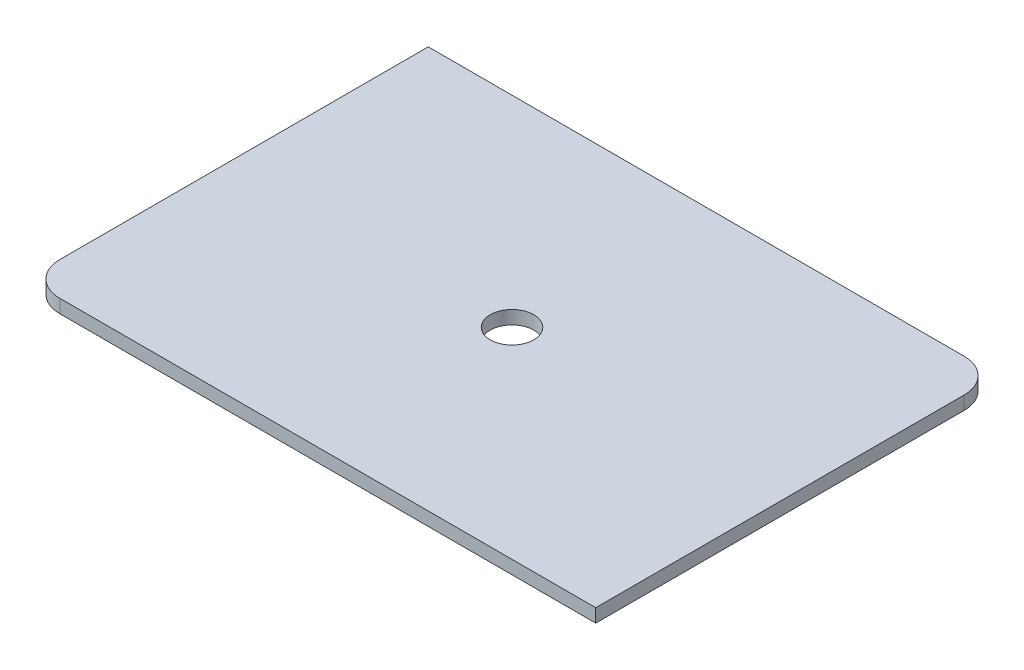
ISO-10303-21;
HEADER;
FILE_DESCRIPTION(('STEP AP214'),'2;1');
FILE_NAME('part.step','',(''),(''),'','','');
FILE_SCHEMA(('AUTOMOTIVE_DESIGN { 1 0 10303 214 1 1 1 1 }'));
ENDSEC;
DATA;
#1=APPLICATION_CONTEXT('core data for automotive mechanical design processes');
#2=APPLICATION_PROTOCOL_DEFINITION('international standard','automotive_design',2000,#1);
#3=PRODUCT_CONTEXT('',#1,'mechanical');
#4=PRODUCT('Part','Part','',(#3));
#5=PRODUCT_RELATED_PRODUCT_CATEGORY('part','',(#4));
#6=PRODUCT_DEFINITION_FORMATION('','',#4);
#7=PRODUCT_DEFINITION_CONTEXT('part definition',#1,'design');
#8=PRODUCT_DEFINITION('design','',#6,#7);
#9=PRODUCT_DEFINITION_SHAPE('','',#8);
#10=(LENGTH_UNIT() NAMED_UNIT(*) SI_UNIT(.MILLI.,.METRE.));
#11=(NAMED_UNIT(*) PLANE_ANGLE_UNIT() SI_UNIT($,.RADIAN.));
#12=(NAMED_UNIT(*) SI_UNIT($,.STERADIAN.) SOLID_ANGLE_UNIT());
#13=UNCERTAINTY_MEASURE_WITH_UNIT(LENGTH_MEASURE(1.E-05),#10,'distance_accuracy_value','');
#14=(GEOMETRIC_REPRESENTATION_CONTEXT(3) GLOBAL_UNCERTAINTY_ASSIGNED_CONTEXT((#13)) GLOBAL_UNIT_ASSIGNED_CONTEXT((#10,
#11,#12)) REPRESENTATION_CONTEXT('',''));
#15=CARTESIAN_POINT('',(0.,0.,0.));
#16=DIRECTION('',(0.,0.,1.));
#17=DIRECTION('',(1.,0.,0.));
#18=AXIS2_PLACEMENT_3D('',#15,#16,#17);
#19=CARTESIAN_POINT('',(85.,-4.,60.));
#20=DIRECTION('',(0.,0.,1.));
#21=DIRECTION('',(1.,0.,0.));
#22=AXIS2_PLACEMENT_3D('',#19,#20,#21);
#23=PLANE('',#22);
#24=DIRECTION('',(1.,0.,0.));
#25=VECTOR('',#24,1.);
#26=CARTESIAN_POINT('',(85.,0.,60.));
#27=LINE('',#26,#25);
#28=CARTESIAN_POINT('',(-74.9999999999999,0.,60.));
#29=VERTEX_POINT('',#28);
#30=CARTESIAN_POINT('',(85.,0.,60.));
#31=VERTEX_POINT('',#30);
#32=EDGE_CURVE('E124',#29,#31,#27,.T.);
#33=ORIENTED_EDGE('',*,*,#32,.F.);
#34=DIRECTION('',(0.,1.,0.));
#35=VECTOR('',#34,1.);
#36=CARTESIAN_POINT('',(-74.9999999999999,-4.,60.));
#37=LINE('',#36,#35);
#38=CARTESIAN_POINT('',(-74.9999999999999,-4.,60.));
#39=VERTEX_POINT('',#38);
#40=EDGE_CURVE('E11',#39,#29,#37,.T.);
#41=ORIENTED_EDGE('',*,*,#40,.F.);
#42=DIRECTION('',(1.,0.,0.));
#43=VECTOR('',#42,1.);
#44=CARTESIAN_POINT('',(85.,-4.,60.));
#45=LINE('',#44,#43);
#46=CARTESIAN_POINT('',(85.,-4.,60.));
#47=VERTEX_POINT('',#46);
#48=EDGE_CURVE('E139',#39,#47,#45,.T.);
#49=ORIENTED_EDGE('',*,*,#48,.T.);
#50=DIRECTION('',(0.,1.,0.));
#51=VECTOR('',#50,1.);
#52=CARTESIAN_POINT('',(85.,-4.,60.));
#53=LINE('',#52,#51);
#54=EDGE_CURVE('E42',#47,#31,#53,.T.);
#55=ORIENTED_EDGE('',*,*,#54,.T.);
#56=EDGE_LOOP('',(#33,#41,#49,#55));
#57=FACE_BOUND('',#56,.T.);
#58=ADVANCED_FACE('F39',(#57),#23,.T.);
#59=CARTESIAN_POINT('',(-75.,-4.,50.));
#60=DIRECTION('',(0.,1.,0.));
#61=DIRECTION('',(0.,0.,1.));
#62=AXIS2_PLACEMENT_3D('',#59,#60,#61);
#63=CYLINDRICAL_SURFACE('',#62,10.);
#64=CARTESIAN_POINT('',(-75.,0.,50.));
#65=DIRECTION('',(0.,1.,0.));
#66=DIRECTION('',(0.,0.,-1.));
#67=AXIS2_PLACEMENT_3D('',#64,#65,#66);
#68=CIRCLE('',#67,10.);
#69=CARTESIAN_POINT('',(-85.,0.,49.9999999999999));
#70=VERTEX_POINT('',#69);
#71=EDGE_CURVE('E137',#70,#29,#68,.T.);
#72=ORIENTED_EDGE('',*,*,#71,.F.);
#73=DIRECTION('',(0.,1.,0.));
#74=VECTOR('',#73,1.);
#75=CARTESIAN_POINT('',(-85.,-4.,49.9999999999999));
#76=LINE('',#75,#74);
#77=CARTESIAN_POINT('',(-85.,-4.,49.9999999999999));
#78=VERTEX_POINT('',#77);
#79=EDGE_CURVE('E48',#78,#70,#76,.T.);
#80=ORIENTED_EDGE('',*,*,#79,.F.);
#81=CARTESIAN_POINT('',(-75.,-4.,50.));
#82=DIRECTION('',(0.,1.,0.));
#83=DIRECTION('',(0.,0.,-1.));
#84=AXIS2_PLACEMENT_3D('',#81,#82,#83);
#85=CIRCLE('',#84,10.);
#86=EDGE_CURVE('E114',#78,#39,#85,.T.);
#87=ORIENTED_EDGE('',*,*,#86,.T.);
#88=ORIENTED_EDGE('',*,*,#40,.T.);
#89=EDGE_LOOP('',(#72,#80,#87,#88));
#90=FACE_BOUND('',#89,.T.);
#91=ADVANCED_FACE('F147',(#90),#63,.T.);
#92=CARTESIAN_POINT('',(-85.,-4.,-60.));
#93=DIRECTION('',(-1.,0.,0.));
#94=DIRECTION('',(0.,0.,1.));
#95=AXIS2_PLACEMENT_3D('',#92,#93,#94);
#96=PLANE('',#95);
#97=DIRECTION('',(0.,0.,1.));
#98=VECTOR('',#97,1.);
#99=CARTESIAN_POINT('',(-85.,0.,-60.));
#100=LINE('',#99,#98);
#101=CARTESIAN_POINT('',(-85.,0.,-60.));
#102=VERTEX_POINT('',#101);
#103=EDGE_CURVE('E101',#102,#70,#100,.T.);
#104=ORIENTED_EDGE('',*,*,#103,.F.);
#105=DIRECTION('',(0.,1.,0.));
#106=VECTOR('',#105,1.);
#107=CARTESIAN_POINT('',(-85.,-4.,-60.));
#108=LINE('',#107,#106);
#109=CARTESIAN_POINT('',(-85.,-4.,-60.));
#110=VERTEX_POINT('',#109);
#111=EDGE_CURVE('E96',#110,#102,#108,.T.);
#112=ORIENTED_EDGE('',*,*,#111,.F.);
#113=DIRECTION('',(0.,0.,1.));
#114=VECTOR('',#113,1.);
#115=CARTESIAN_POINT('',(-85.,-4.,-60.));
#116=LINE('',#115,#114);
#117=EDGE_CURVE('E99',#110,#78,#116,.T.);
#118=ORIENTED_EDGE('',*,*,#117,.T.);
#119=ORIENTED_EDGE('',*,*,#79,.T.);
#120=EDGE_LOOP('',(#104,#112,#118,#119));
#121=FACE_BOUND('',#120,.T.);
#122=ADVANCED_FACE('F98',(#121),#96,.T.);
#123=CARTESIAN_POINT('',(74.9999999999999,-4.,-60.));
#124=DIRECTION('',(0.,0.,-1.));
#125=DIRECTION('',(-1.,0.,0.));
#126=AXIS2_PLACEMENT_3D('',#123,#124,#125);
#127=PLANE('',#126);
#128=DIRECTION('',(-1.,0.,0.));
#129=VECTOR('',#128,1.);
#130=CARTESIAN_POINT('',(74.9999999999999,0.,-60.));
#131=LINE('',#130,#129);
#132=CARTESIAN_POINT('',(74.9999999999999,0.,-60.));
#133=VERTEX_POINT('',#132);
#134=EDGE_CURVE('E134',#133,#102,#131,.T.);
#135=ORIENTED_EDGE('',*,*,#134,.F.);
#136=DIRECTION('',(0.,1.,0.));
#137=VECTOR('',#136,1.);
#138=CARTESIAN_POINT('',(74.9999999999999,-4.,-60.));
#139=LINE('',#138,#137);
#140=CARTESIAN_POINT('',(74.9999999999999,-4.,-60.));
#141=VERTEX_POINT('',#140);
#142=EDGE_CURVE('E106',#141,#133,#139,.T.);
#143=ORIENTED_EDGE('',*,*,#142,.F.);
#144=DIRECTION('',(-1.,0.,0.));
#145=VECTOR('',#144,1.);
#146=CARTESIAN_POINT('',(74.9999999999999,-4.,-60.));
#147=LINE('',#146,#145);
#148=EDGE_CURVE('E112',#141,#110,#147,.T.);
#149=ORIENTED_EDGE('',*,*,#148,.T.);
#150=ORIENTED_EDGE('',*,*,#111,.T.);
#151=EDGE_LOOP('',(#135,#143,#149,#150));
#152=FACE_BOUND('',#151,.T.);
#153=ADVANCED_FACE('F116',(#152),#127,.T.);
#154=CARTESIAN_POINT('',(75.,-4.,-50.));
#155=DIRECTION('',(0.,1.,0.));
#156=DIRECTION('',(0.,0.,1.));
#157=AXIS2_PLACEMENT_3D('',#154,#155,#156);
#158=CYLINDRICAL_SURFACE('',#157,10.);
#159=CARTESIAN_POINT('',(75.,0.,-50.));
#160=DIRECTION('',(0.,1.,0.));
#161=DIRECTION('',(0.,0.,-1.));
#162=AXIS2_PLACEMENT_3D('',#159,#160,#161);
#163=CIRCLE('',#162,10.);
#164=CARTESIAN_POINT('',(85.,0.,-50.));
#165=VERTEX_POINT('',#164);
#166=EDGE_CURVE('E131',#165,#133,#163,.T.);
#167=ORIENTED_EDGE('',*,*,#166,.F.);
#168=DIRECTION('',(0.,1.,0.));
#169=VECTOR('',#168,1.);
#170=CARTESIAN_POINT('',(85.,-4.,-50.));
#171=LINE('',#170,#169);
#172=CARTESIAN_POINT('',(85.,-4.,-50.));
#173=VERTEX_POINT('',#172);
#174=EDGE_CURVE('E142',#173,#165,#171,.T.);
#175=ORIENTED_EDGE('',*,*,#174,.F.);
#176=CARTESIAN_POINT('',(75.,-4.,-50.));
#177=DIRECTION('',(0.,1.,0.));
#178=DIRECTION('',(0.,0.,-1.));
#179=AXIS2_PLACEMENT_3D('',#176,#177,#178);
#180=CIRCLE('',#179,10.);
#181=EDGE_CURVE('E117',#173,#141,#180,.T.);
#182=ORIENTED_EDGE('',*,*,#181,.T.);
#183=ORIENTED_EDGE('',*,*,#142,.T.);
#184=EDGE_LOOP('',(#167,#175,#182,#183));
#185=FACE_BOUND('',#184,.T.);
#186=ADVANCED_FACE('F160',(#185),#158,.T.);
#187=CARTESIAN_POINT('',(85.,-4.,-50.));
#188=DIRECTION('',(1.,0.,0.));
#189=DIRECTION('',(0.,0.,-1.));
#190=AXIS2_PLACEMENT_3D('',#187,#188,#189);
#191=PLANE('',#190);
#192=DIRECTION('',(0.,0.,-1.));
#193=VECTOR('',#192,1.);
#194=CARTESIAN_POINT('',(85.,0.,-50.));
#195=LINE('',#194,#193);
#196=EDGE_CURVE('E127',#31,#165,#195,.T.);
#197=ORIENTED_EDGE('',*,*,#196,.F.);
#198=ORIENTED_EDGE('',*,*,#54,.F.);
#199=DIRECTION('',(0.,0.,-1.));
#200=VECTOR('',#199,1.);
#201=CARTESIAN_POINT('',(85.,-4.,-50.));
#202=LINE('',#201,#200);
#203=EDGE_CURVE('E119',#47,#173,#202,.T.);
#204=ORIENTED_EDGE('',*,*,#203,.T.);
#205=ORIENTED_EDGE('',*,*,#174,.T.);
#206=EDGE_LOOP('',(#197,#198,#204,#205));
#207=FACE_BOUND('',#206,.T.);
#208=ADVANCED_FACE('F144',(#207),#191,.T.);
#209=CARTESIAN_POINT('',(-75.,-4.,50.));
#210=DIRECTION('',(0.,-1.,0.));
#211=DIRECTION('',(0.,0.,-1.));
#212=AXIS2_PLACEMENT_3D('',#209,#210,#211);
#213=PLANE('',#212);
#214=CARTESIAN_POINT('',(0.,-4.,0.));
#215=DIRECTION('',(0.,-1.,0.));
#216=DIRECTION('',(0.,0.,-1.));
#217=AXIS2_PLACEMENT_3D('',#214,#215,#216);
#218=CIRCLE('',#217,6.5);
#219=CARTESIAN_POINT('',(0.,-4.,-6.5));
#220=VERTEX_POINT('',#219);
#221=EDGE_CURVE('E181',#220,#220,#218,.F.);
#222=ORIENTED_EDGE('',*,*,#221,.T.);
#223=EDGE_LOOP('',(#222));
#224=FACE_BOUND('',#223,.T.);
#225=ORIENTED_EDGE('',*,*,#48,.F.);
#226=ORIENTED_EDGE('',*,*,#86,.F.);
#227=ORIENTED_EDGE('',*,*,#117,.F.);
#228=ORIENTED_EDGE('',*,*,#148,.F.);
#229=ORIENTED_EDGE('',*,*,#181,.F.);
#230=ORIENTED_EDGE('',*,*,#203,.F.);
#231=EDGE_LOOP('',(#225,#226,#227,#228,#229,#230));
#232=FACE_BOUND('',#231,.T.);
#233=ADVANCED_FACE('F110',(#224,#232),#213,.T.);
#234=CARTESIAN_POINT('',(-75.,0.,50.));
#235=DIRECTION('',(0.,-1.,0.));
#236=DIRECTION('',(0.,0.,-1.));
#237=AXIS2_PLACEMENT_3D('',#234,#235,#236);
#238=PLANE('',#237);
#239=CARTESIAN_POINT('',(0.,0.,0.));
#240=DIRECTION('',(0.,1.,0.));
#241=DIRECTION('',(0.,0.,1.));
#242=AXIS2_PLACEMENT_3D('',#239,#240,#241);
#243=CIRCLE('',#242,6.5);
#244=CARTESIAN_POINT('',(0.,0.,6.5));
#245=VERTEX_POINT('',#244);
#246=EDGE_CURVE('E128',#245,#245,#243,.T.);
#247=ORIENTED_EDGE('',*,*,#246,.F.);
#248=EDGE_LOOP('',(#247));
#249=FACE_BOUND('',#248,.T.);
#250=ORIENTED_EDGE('',*,*,#32,.T.);
#251=ORIENTED_EDGE('',*,*,#196,.T.);
#252=ORIENTED_EDGE('',*,*,#166,.T.);
#253=ORIENTED_EDGE('',*,*,#134,.T.);
#254=ORIENTED_EDGE('',*,*,#103,.T.);
#255=ORIENTED_EDGE('',*,*,#71,.T.);
#256=EDGE_LOOP('',(#250,#251,#252,#253,#254,#255));
#257=FACE_BOUND('',#256,.T.);
#258=ADVANCED_FACE('F146',(#249,#257),#238,.F.);
#259=CARTESIAN_POINT('',(0.,-4.001,0.));
#260=DIRECTION('',(0.,1.,0.));
#261=DIRECTION('',(0.,0.,1.));
#262=AXIS2_PLACEMENT_3D('',#259,#260,#261);
#263=CYLINDRICAL_SURFACE('',#262,6.5);
#264=ORIENTED_EDGE('',*,*,#221,.F.);
#265=EDGE_LOOP('',(#264));
#266=FACE_BOUND('',#265,.T.);
#267=ORIENTED_EDGE('',*,*,#246,.T.);
#268=EDGE_LOOP('',(#267));
#269=FACE_BOUND('',#268,.T.);
#270=ADVANCED_FACE('F171',(#266,#269),#263,.F.);
#271=CLOSED_SHELL('',(#58,#91,#122,#153,#186,#208,#233,#258,#270));
#272=MANIFOLD_SOLID_BREP('B2',#271);
#273=ADVANCED_BREP_SHAPE_REPRESENTATION('',(#18,#272),#14);
#274=SHAPE_DEFINITION_REPRESENTATION(#9,#273);
ENDSEC;
END-ISO-10303-21;
